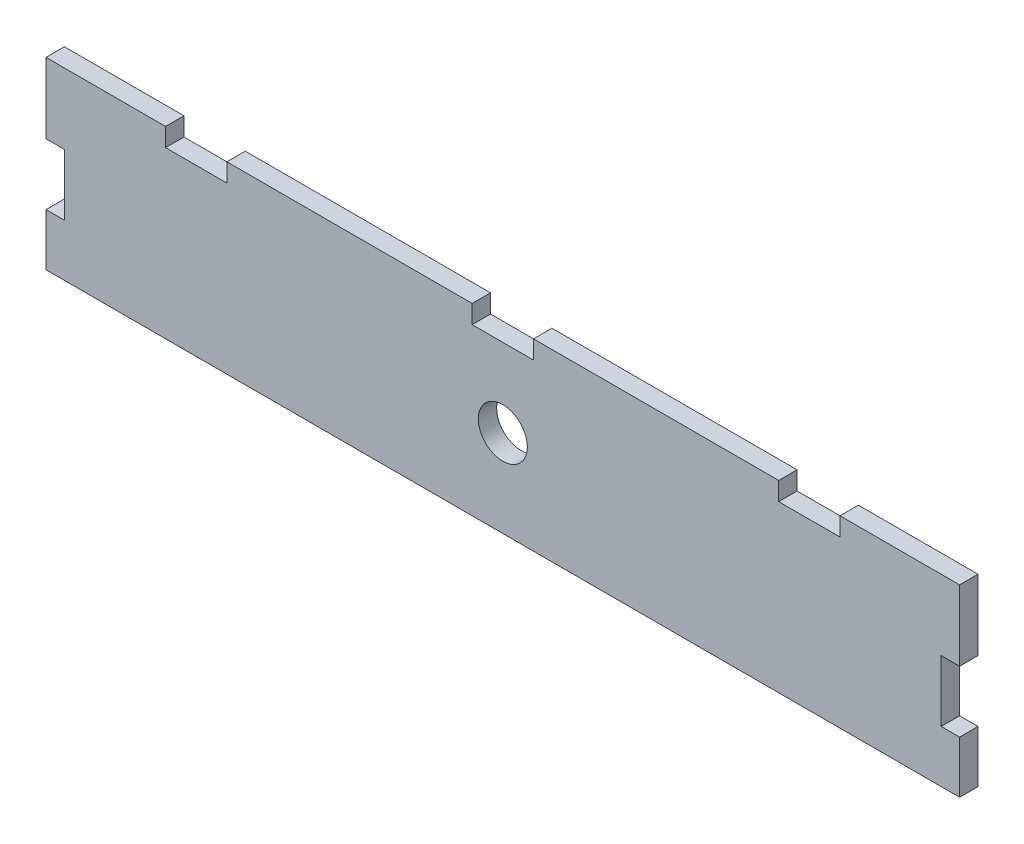
ISO-10303-21;
HEADER;
FILE_DESCRIPTION(('STEP AP214'),'2;1');
FILE_NAME('part.step','',(''),(''),'','','');
FILE_SCHEMA(('AUTOMOTIVE_DESIGN { 1 0 10303 214 1 1 1 1 }'));
ENDSEC;
DATA;
#1=APPLICATION_CONTEXT('core data for automotive mechanical design processes');
#2=APPLICATION_PROTOCOL_DEFINITION('international standard','automotive_design',2000,#1);
#3=PRODUCT_CONTEXT('',#1,'mechanical');
#4=PRODUCT('Part','Part','',(#3));
#5=PRODUCT_RELATED_PRODUCT_CATEGORY('part','',(#4));
#6=PRODUCT_DEFINITION_FORMATION('','',#4);
#7=PRODUCT_DEFINITION_CONTEXT('part definition',#1,'design');
#8=PRODUCT_DEFINITION('design','',#6,#7);
#9=PRODUCT_DEFINITION_SHAPE('','',#8);
#10=(LENGTH_UNIT() NAMED_UNIT(*) SI_UNIT(.MILLI.,.METRE.));
#11=(NAMED_UNIT(*) PLANE_ANGLE_UNIT() SI_UNIT($,.RADIAN.));
#12=(NAMED_UNIT(*) SI_UNIT($,.STERADIAN.) SOLID_ANGLE_UNIT());
#13=UNCERTAINTY_MEASURE_WITH_UNIT(LENGTH_MEASURE(1.E-05),#10,'distance_accuracy_value','');
#14=(GEOMETRIC_REPRESENTATION_CONTEXT(3) GLOBAL_UNCERTAINTY_ASSIGNED_CONTEXT((#13)) GLOBAL_UNIT_ASSIGNED_CONTEXT((#10,
#11,#12)) REPRESENTATION_CONTEXT('',''));
#15=CARTESIAN_POINT('',(0.,0.,0.));
#16=DIRECTION('',(0.,0.,1.));
#17=DIRECTION('',(1.,0.,0.));
#18=AXIS2_PLACEMENT_3D('',#15,#16,#17);
#19=CARTESIAN_POINT('',(74.5,-18.5,3.));
#20=DIRECTION('',(-1.,0.,0.));
#21=DIRECTION('',(0.,0.,1.));
#22=AXIS2_PLACEMENT_3D('',#19,#20,#21);
#23=PLANE('',#22);
#24=DIRECTION('',(0.,1.,0.));
#25=VECTOR('',#24,1.);
#26=CARTESIAN_POINT('',(74.5,-18.5,0.));
#27=LINE('',#26,#25);
#28=CARTESIAN_POINT('',(74.5,-27.,0.));
#29=VERTEX_POINT('',#28);
#30=CARTESIAN_POINT('',(74.5,-18.5,0.));
#31=VERTEX_POINT('',#30);
#32=EDGE_CURVE('E225',#29,#31,#27,.T.);
#33=ORIENTED_EDGE('',*,*,#32,.T.);
#34=DIRECTION('',(0.,0.,-1.));
#35=VECTOR('',#34,1.);
#36=CARTESIAN_POINT('',(74.5,-18.5,3.));
#37=LINE('',#36,#35);
#38=CARTESIAN_POINT('',(74.5,-18.5,3.));
#39=VERTEX_POINT('',#38);
#40=EDGE_CURVE('E11',#39,#31,#37,.T.);
#41=ORIENTED_EDGE('',*,*,#40,.F.);
#42=DIRECTION('',(0.,1.,0.));
#43=VECTOR('',#42,1.);
#44=CARTESIAN_POINT('',(74.5,-18.5,3.));
#45=LINE('',#44,#43);
#46=CARTESIAN_POINT('',(74.5,-27.,3.));
#47=VERTEX_POINT('',#46);
#48=EDGE_CURVE('E272',#47,#39,#45,.T.);
#49=ORIENTED_EDGE('',*,*,#48,.F.);
#50=DIRECTION('',(0.,0.,-1.));
#51=VECTOR('',#50,1.);
#52=CARTESIAN_POINT('',(74.5,-27.,3.));
#53=LINE('',#52,#51);
#54=EDGE_CURVE('E221',#47,#29,#53,.T.);
#55=ORIENTED_EDGE('',*,*,#54,.T.);
#56=EDGE_LOOP('',(#33,#41,#49,#55));
#57=FACE_BOUND('',#56,.T.);
#58=ADVANCED_FACE('F33',(#57),#23,.F.);
#59=CARTESIAN_POINT('',(71.5,-18.5,3.));
#60=DIRECTION('',(0.,-1.,0.));
#61=DIRECTION('',(0.,0.,-1.));
#62=AXIS2_PLACEMENT_3D('',#59,#60,#61);
#63=PLANE('',#62);
#64=DIRECTION('',(-1.,0.,0.));
#65=VECTOR('',#64,1.);
#66=CARTESIAN_POINT('',(71.5,-18.5,0.));
#67=LINE('',#66,#65);
#68=CARTESIAN_POINT('',(71.5,-18.5,0.));
#69=VERTEX_POINT('',#68);
#70=EDGE_CURVE('E228',#31,#69,#67,.T.);
#71=ORIENTED_EDGE('',*,*,#70,.T.);
#72=DIRECTION('',(0.,0.,-1.));
#73=VECTOR('',#72,1.);
#74=CARTESIAN_POINT('',(71.5,-18.5,3.));
#75=LINE('',#74,#73);
#76=CARTESIAN_POINT('',(71.5,-18.5,3.));
#77=VERTEX_POINT('',#76);
#78=EDGE_CURVE('E41',#77,#69,#75,.T.);
#79=ORIENTED_EDGE('',*,*,#78,.F.);
#80=DIRECTION('',(-1.,0.,0.));
#81=VECTOR('',#80,1.);
#82=CARTESIAN_POINT('',(71.5,-18.5,3.));
#83=LINE('',#82,#81);
#84=EDGE_CURVE('E140',#39,#77,#83,.T.);
#85=ORIENTED_EDGE('',*,*,#84,.F.);
#86=ORIENTED_EDGE('',*,*,#40,.T.);
#87=EDGE_LOOP('',(#71,#79,#85,#86));
#88=FACE_BOUND('',#87,.T.);
#89=ADVANCED_FACE('F411',(#88),#63,.F.);
#90=CARTESIAN_POINT('',(71.5,-8.5,3.));
#91=DIRECTION('',(-1.,0.,0.));
#92=DIRECTION('',(0.,0.,1.));
#93=AXIS2_PLACEMENT_3D('',#90,#91,#92);
#94=PLANE('',#93);
#95=DIRECTION('',(0.,1.,0.));
#96=VECTOR('',#95,1.);
#97=CARTESIAN_POINT('',(71.5,-8.5,0.));
#98=LINE('',#97,#96);
#99=CARTESIAN_POINT('',(71.5,-8.5,0.));
#100=VERTEX_POINT('',#99);
#101=EDGE_CURVE('E231',#69,#100,#98,.T.);
#102=ORIENTED_EDGE('',*,*,#101,.T.);
#103=DIRECTION('',(0.,0.,-1.));
#104=VECTOR('',#103,1.);
#105=CARTESIAN_POINT('',(71.5,-8.5,3.));
#106=LINE('',#105,#104);
#107=CARTESIAN_POINT('',(71.5,-8.5,3.));
#108=VERTEX_POINT('',#107);
#109=EDGE_CURVE('E327',#108,#100,#106,.T.);
#110=ORIENTED_EDGE('',*,*,#109,.F.);
#111=DIRECTION('',(0.,1.,0.));
#112=VECTOR('',#111,1.);
#113=CARTESIAN_POINT('',(71.5,-8.5,3.));
#114=LINE('',#113,#112);
#115=EDGE_CURVE('E335',#77,#108,#114,.T.);
#116=ORIENTED_EDGE('',*,*,#115,.F.);
#117=ORIENTED_EDGE('',*,*,#78,.T.);
#118=EDGE_LOOP('',(#102,#110,#116,#117));
#119=FACE_BOUND('',#118,.T.);
#120=ADVANCED_FACE('F333',(#119),#94,.F.);
#121=CARTESIAN_POINT('',(71.5,-8.5,3.));
#122=DIRECTION('',(0.,1.,0.));
#123=DIRECTION('',(0.,0.,1.));
#124=AXIS2_PLACEMENT_3D('',#121,#122,#123);
#125=PLANE('',#124);
#126=DIRECTION('',(1.,0.,0.));
#127=VECTOR('',#126,1.);
#128=CARTESIAN_POINT('',(71.5,-8.5,0.));
#129=LINE('',#128,#127);
#130=CARTESIAN_POINT('',(74.5,-8.5,0.));
#131=VERTEX_POINT('',#130);
#132=EDGE_CURVE('E233',#100,#131,#129,.T.);
#133=ORIENTED_EDGE('',*,*,#132,.T.);
#134=DIRECTION('',(0.,0.,-1.));
#135=VECTOR('',#134,1.);
#136=CARTESIAN_POINT('',(74.5,-8.5,3.));
#137=LINE('',#136,#135);
#138=CARTESIAN_POINT('',(74.5,-8.5,3.));
#139=VERTEX_POINT('',#138);
#140=EDGE_CURVE('E324',#139,#131,#137,.T.);
#141=ORIENTED_EDGE('',*,*,#140,.F.);
#142=DIRECTION('',(1.,0.,0.));
#143=VECTOR('',#142,1.);
#144=CARTESIAN_POINT('',(71.5,-8.5,3.));
#145=LINE('',#144,#143);
#146=EDGE_CURVE('E353',#108,#139,#145,.T.);
#147=ORIENTED_EDGE('',*,*,#146,.F.);
#148=ORIENTED_EDGE('',*,*,#109,.T.);
#149=EDGE_LOOP('',(#133,#141,#147,#148));
#150=FACE_BOUND('',#149,.T.);
#151=ADVANCED_FACE('F344',(#150),#125,.F.);
#152=CARTESIAN_POINT('',(74.5,3.00000000000001,3.));
#153=DIRECTION('',(-1.,0.,0.));
#154=DIRECTION('',(0.,-1.,0.));
#155=AXIS2_PLACEMENT_3D('',#152,#153,#154);
#156=PLANE('',#155);
#157=DIRECTION('',(0.,1.,0.));
#158=VECTOR('',#157,1.);
#159=CARTESIAN_POINT('',(74.5,3.00000000000001,0.));
#160=LINE('',#159,#158);
#161=CARTESIAN_POINT('',(74.5,3.00000000000001,0.));
#162=VERTEX_POINT('',#161);
#163=EDGE_CURVE('E235',#131,#162,#160,.T.);
#164=ORIENTED_EDGE('',*,*,#163,.T.);
#165=DIRECTION('',(0.,0.,-1.));
#166=VECTOR('',#165,1.);
#167=CARTESIAN_POINT('',(74.5,3.00000000000001,3.));
#168=LINE('',#167,#166);
#169=CARTESIAN_POINT('',(74.5,3.00000000000001,3.));
#170=VERTEX_POINT('',#169);
#171=EDGE_CURVE('E321',#170,#162,#168,.T.);
#172=ORIENTED_EDGE('',*,*,#171,.F.);
#173=DIRECTION('',(0.,1.,0.));
#174=VECTOR('',#173,1.);
#175=CARTESIAN_POINT('',(74.5,3.00000000000001,3.));
#176=LINE('',#175,#174);
#177=EDGE_CURVE('E350',#139,#170,#176,.T.);
#178=ORIENTED_EDGE('',*,*,#177,.F.);
#179=ORIENTED_EDGE('',*,*,#140,.T.);
#180=EDGE_LOOP('',(#164,#172,#178,#179));
#181=FACE_BOUND('',#180,.T.);
#182=ADVANCED_FACE('F348',(#181),#156,.F.);
#183=CARTESIAN_POINT('',(74.5,3.00000000000001,3.));
#184=DIRECTION('',(0.,-1.,0.));
#185=DIRECTION('',(1.,0.,0.));
#186=AXIS2_PLACEMENT_3D('',#183,#184,#185);
#187=PLANE('',#186);
#188=DIRECTION('',(-1.,0.,0.));
#189=VECTOR('',#188,1.);
#190=CARTESIAN_POINT('',(74.5,3.00000000000001,0.));
#191=LINE('',#190,#189);
#192=CARTESIAN_POINT('',(55.,2.99999999999999,0.));
#193=VERTEX_POINT('',#192);
#194=EDGE_CURVE('E237',#162,#193,#191,.T.);
#195=ORIENTED_EDGE('',*,*,#194,.T.);
#196=DIRECTION('',(0.,0.,-1.));
#197=VECTOR('',#196,1.);
#198=CARTESIAN_POINT('',(55.,2.99999999999999,3.));
#199=LINE('',#198,#197);
#200=CARTESIAN_POINT('',(55.,2.99999999999999,3.));
#201=VERTEX_POINT('',#200);
#202=EDGE_CURVE('E318',#201,#193,#199,.T.);
#203=ORIENTED_EDGE('',*,*,#202,.F.);
#204=DIRECTION('',(-1.,0.,0.));
#205=VECTOR('',#204,1.);
#206=CARTESIAN_POINT('',(74.5,3.00000000000001,3.));
#207=LINE('',#206,#205);
#208=EDGE_CURVE('E352',#170,#201,#207,.T.);
#209=ORIENTED_EDGE('',*,*,#208,.F.);
#210=ORIENTED_EDGE('',*,*,#171,.T.);
#211=EDGE_LOOP('',(#195,#203,#209,#210));
#212=FACE_BOUND('',#211,.T.);
#213=ADVANCED_FACE('F424',(#212),#187,.F.);
#214=CARTESIAN_POINT('',(55.,2.99999999999999,3.));
#215=DIRECTION('',(1.,0.,0.));
#216=DIRECTION('',(0.,0.,-1.));
#217=AXIS2_PLACEMENT_3D('',#214,#215,#216);
#218=PLANE('',#217);
#219=DIRECTION('',(0.,-1.,0.));
#220=VECTOR('',#219,1.);
#221=CARTESIAN_POINT('',(55.,2.99999999999999,0.));
#222=LINE('',#221,#220);
#223=CARTESIAN_POINT('',(55.,0.,0.));
#224=VERTEX_POINT('',#223);
#225=EDGE_CURVE('E239',#193,#224,#222,.T.);
#226=ORIENTED_EDGE('',*,*,#225,.T.);
#227=DIRECTION('',(0.,0.,-1.));
#228=VECTOR('',#227,1.);
#229=CARTESIAN_POINT('',(55.,0.,3.));
#230=LINE('',#229,#228);
#231=CARTESIAN_POINT('',(55.,0.,3.));
#232=VERTEX_POINT('',#231);
#233=EDGE_CURVE('E315',#232,#224,#230,.T.);
#234=ORIENTED_EDGE('',*,*,#233,.F.);
#235=DIRECTION('',(0.,-1.,0.));
#236=VECTOR('',#235,1.);
#237=CARTESIAN_POINT('',(55.,2.99999999999999,3.));
#238=LINE('',#237,#236);
#239=EDGE_CURVE('E355',#201,#232,#238,.T.);
#240=ORIENTED_EDGE('',*,*,#239,.F.);
#241=ORIENTED_EDGE('',*,*,#202,.T.);
#242=EDGE_LOOP('',(#226,#234,#240,#241));
#243=FACE_BOUND('',#242,.T.);
#244=ADVANCED_FACE('F427',(#243),#218,.F.);
#245=CARTESIAN_POINT('',(45.,0.,3.));
#246=DIRECTION('',(0.,-1.,0.));
#247=DIRECTION('',(0.,0.,-1.));
#248=AXIS2_PLACEMENT_3D('',#245,#246,#247);
#249=PLANE('',#248);
#250=DIRECTION('',(-1.,0.,0.));
#251=VECTOR('',#250,1.);
#252=CARTESIAN_POINT('',(45.,0.,0.));
#253=LINE('',#252,#251);
#254=CARTESIAN_POINT('',(45.,0.,0.));
#255=VERTEX_POINT('',#254);
#256=EDGE_CURVE('E241',#224,#255,#253,.T.);
#257=ORIENTED_EDGE('',*,*,#256,.T.);
#258=DIRECTION('',(0.,0.,-1.));
#259=VECTOR('',#258,1.);
#260=CARTESIAN_POINT('',(45.,0.,3.));
#261=LINE('',#260,#259);
#262=CARTESIAN_POINT('',(45.,0.,3.));
#263=VERTEX_POINT('',#262);
#264=EDGE_CURVE('E312',#263,#255,#261,.T.);
#265=ORIENTED_EDGE('',*,*,#264,.F.);
#266=DIRECTION('',(-1.,0.,0.));
#267=VECTOR('',#266,1.);
#268=CARTESIAN_POINT('',(45.,0.,3.));
#269=LINE('',#268,#267);
#270=EDGE_CURVE('E361',#232,#263,#269,.T.);
#271=ORIENTED_EDGE('',*,*,#270,.F.);
#272=ORIENTED_EDGE('',*,*,#233,.T.);
#273=EDGE_LOOP('',(#257,#265,#271,#272));
#274=FACE_BOUND('',#273,.T.);
#275=ADVANCED_FACE('F431',(#274),#249,.F.);
#276=CARTESIAN_POINT('',(45.,2.99999999999999,3.));
#277=DIRECTION('',(-1.,0.,0.));
#278=DIRECTION('',(0.,0.,1.));
#279=AXIS2_PLACEMENT_3D('',#276,#277,#278);
#280=PLANE('',#279);
#281=DIRECTION('',(0.,1.,0.));
#282=VECTOR('',#281,1.);
#283=CARTESIAN_POINT('',(45.,2.99999999999999,0.));
#284=LINE('',#283,#282);
#285=CARTESIAN_POINT('',(45.,2.99999999999999,0.));
#286=VERTEX_POINT('',#285);
#287=EDGE_CURVE('E243',#255,#286,#284,.T.);
#288=ORIENTED_EDGE('',*,*,#287,.T.);
#289=DIRECTION('',(0.,0.,-1.));
#290=VECTOR('',#289,1.);
#291=CARTESIAN_POINT('',(45.,2.99999999999999,3.));
#292=LINE('',#291,#290);
#293=CARTESIAN_POINT('',(45.,2.99999999999999,3.));
#294=VERTEX_POINT('',#293);
#295=EDGE_CURVE('E309',#294,#286,#292,.T.);
#296=ORIENTED_EDGE('',*,*,#295,.F.);
#297=DIRECTION('',(0.,1.,0.));
#298=VECTOR('',#297,1.);
#299=CARTESIAN_POINT('',(45.,2.99999999999999,3.));
#300=LINE('',#299,#298);
#301=EDGE_CURVE('E363',#263,#294,#300,.T.);
#302=ORIENTED_EDGE('',*,*,#301,.F.);
#303=ORIENTED_EDGE('',*,*,#264,.T.);
#304=EDGE_LOOP('',(#288,#296,#302,#303));
#305=FACE_BOUND('',#304,.T.);
#306=ADVANCED_FACE('F435',(#305),#280,.F.);
#307=CARTESIAN_POINT('',(45.,2.99999999999999,3.));
#308=DIRECTION('',(0.,-1.,0.));
#309=DIRECTION('',(1.,0.,0.));
#310=AXIS2_PLACEMENT_3D('',#307,#308,#309);
#311=PLANE('',#310);
#312=DIRECTION('',(-1.,0.,0.));
#313=VECTOR('',#312,1.);
#314=CARTESIAN_POINT('',(45.,2.99999999999999,0.));
#315=LINE('',#314,#313);
#316=CARTESIAN_POINT('',(5.,3.,0.));
#317=VERTEX_POINT('',#316);
#318=EDGE_CURVE('E245',#286,#317,#315,.T.);
#319=ORIENTED_EDGE('',*,*,#318,.T.);
#320=DIRECTION('',(0.,0.,-1.));
#321=VECTOR('',#320,1.);
#322=CARTESIAN_POINT('',(5.,3.,3.));
#323=LINE('',#322,#321);
#324=CARTESIAN_POINT('',(5.,3.,3.));
#325=VERTEX_POINT('',#324);
#326=EDGE_CURVE('E306',#325,#317,#323,.T.);
#327=ORIENTED_EDGE('',*,*,#326,.F.);
#328=DIRECTION('',(-1.,0.,0.));
#329=VECTOR('',#328,1.);
#330=CARTESIAN_POINT('',(45.,2.99999999999999,3.));
#331=LINE('',#330,#329);
#332=EDGE_CURVE('E365',#294,#325,#331,.T.);
#333=ORIENTED_EDGE('',*,*,#332,.F.);
#334=ORIENTED_EDGE('',*,*,#295,.T.);
#335=EDGE_LOOP('',(#319,#327,#333,#334));
#336=FACE_BOUND('',#335,.T.);
#337=ADVANCED_FACE('F439',(#336),#311,.F.);
#338=CARTESIAN_POINT('',(5.,3.,3.));
#339=DIRECTION('',(1.,0.,0.));
#340=DIRECTION('',(0.,1.,0.));
#341=AXIS2_PLACEMENT_3D('',#338,#339,#340);
#342=PLANE('',#341);
#343=DIRECTION('',(0.,-1.,0.));
#344=VECTOR('',#343,1.);
#345=CARTESIAN_POINT('',(5.,3.,0.));
#346=LINE('',#345,#344);
#347=CARTESIAN_POINT('',(5.,0.,0.));
#348=VERTEX_POINT('',#347);
#349=EDGE_CURVE('E247',#317,#348,#346,.T.);
#350=ORIENTED_EDGE('',*,*,#349,.T.);
#351=DIRECTION('',(0.,0.,-1.));
#352=VECTOR('',#351,1.);
#353=CARTESIAN_POINT('',(5.,0.,3.));
#354=LINE('',#353,#352);
#355=CARTESIAN_POINT('',(5.,0.,3.));
#356=VERTEX_POINT('',#355);
#357=EDGE_CURVE('E303',#356,#348,#354,.T.);
#358=ORIENTED_EDGE('',*,*,#357,.F.);
#359=DIRECTION('',(0.,-1.,0.));
#360=VECTOR('',#359,1.);
#361=CARTESIAN_POINT('',(5.,3.,3.));
#362=LINE('',#361,#360);
#363=EDGE_CURVE('E367',#325,#356,#362,.T.);
#364=ORIENTED_EDGE('',*,*,#363,.F.);
#365=ORIENTED_EDGE('',*,*,#326,.T.);
#366=EDGE_LOOP('',(#350,#358,#364,#365));
#367=FACE_BOUND('',#366,.T.);
#368=ADVANCED_FACE('F443',(#367),#342,.F.);
#369=CARTESIAN_POINT('',(-5.,0.,3.));
#370=DIRECTION('',(0.,-1.,0.));
#371=DIRECTION('',(0.,0.,-1.));
#372=AXIS2_PLACEMENT_3D('',#369,#370,#371);
#373=PLANE('',#372);
#374=DIRECTION('',(-1.,0.,0.));
#375=VECTOR('',#374,1.);
#376=CARTESIAN_POINT('',(-5.,0.,0.));
#377=LINE('',#376,#375);
#378=CARTESIAN_POINT('',(-5.,0.,0.));
#379=VERTEX_POINT('',#378);
#380=EDGE_CURVE('E249',#348,#379,#377,.T.);
#381=ORIENTED_EDGE('',*,*,#380,.T.);
#382=DIRECTION('',(0.,0.,-1.));
#383=VECTOR('',#382,1.);
#384=CARTESIAN_POINT('',(-5.,0.,3.));
#385=LINE('',#384,#383);
#386=CARTESIAN_POINT('',(-5.,0.,3.));
#387=VERTEX_POINT('',#386);
#388=EDGE_CURVE('E300',#387,#379,#385,.T.);
#389=ORIENTED_EDGE('',*,*,#388,.F.);
#390=DIRECTION('',(-1.,0.,0.));
#391=VECTOR('',#390,1.);
#392=CARTESIAN_POINT('',(-5.,0.,3.));
#393=LINE('',#392,#391);
#394=EDGE_CURVE('E369',#356,#387,#393,.T.);
#395=ORIENTED_EDGE('',*,*,#394,.F.);
#396=ORIENTED_EDGE('',*,*,#357,.T.);
#397=EDGE_LOOP('',(#381,#389,#395,#396));
#398=FACE_BOUND('',#397,.T.);
#399=ADVANCED_FACE('F447',(#398),#373,.F.);
#400=CARTESIAN_POINT('',(-5.,3.,3.));
#401=DIRECTION('',(-1.,0.,0.));
#402=DIRECTION('',(0.,-1.,0.));
#403=AXIS2_PLACEMENT_3D('',#400,#401,#402);
#404=PLANE('',#403);
#405=DIRECTION('',(0.,1.,0.));
#406=VECTOR('',#405,1.);
#407=CARTESIAN_POINT('',(-5.,3.,0.));
#408=LINE('',#407,#406);
#409=CARTESIAN_POINT('',(-5.,3.,0.));
#410=VERTEX_POINT('',#409);
#411=EDGE_CURVE('E251',#379,#410,#408,.T.);
#412=ORIENTED_EDGE('',*,*,#411,.T.);
#413=DIRECTION('',(0.,0.,-1.));
#414=VECTOR('',#413,1.);
#415=CARTESIAN_POINT('',(-5.,3.,3.));
#416=LINE('',#415,#414);
#417=CARTESIAN_POINT('',(-5.,3.,3.));
#418=VERTEX_POINT('',#417);
#419=EDGE_CURVE('E297',#418,#410,#416,.T.);
#420=ORIENTED_EDGE('',*,*,#419,.F.);
#421=DIRECTION('',(0.,1.,0.));
#422=VECTOR('',#421,1.);
#423=CARTESIAN_POINT('',(-5.,3.,3.));
#424=LINE('',#423,#422);
#425=EDGE_CURVE('E371',#387,#418,#424,.T.);
#426=ORIENTED_EDGE('',*,*,#425,.F.);
#427=ORIENTED_EDGE('',*,*,#388,.T.);
#428=EDGE_LOOP('',(#412,#420,#426,#427));
#429=FACE_BOUND('',#428,.T.);
#430=ADVANCED_FACE('F451',(#429),#404,.F.);
#431=CARTESIAN_POINT('',(-5.,3.,3.));
#432=DIRECTION('',(0.,-1.,0.));
#433=DIRECTION('',(1.,0.,0.));
#434=AXIS2_PLACEMENT_3D('',#431,#432,#433);
#435=PLANE('',#434);
#436=DIRECTION('',(-1.,0.,0.));
#437=VECTOR('',#436,1.);
#438=CARTESIAN_POINT('',(-5.,3.,0.));
#439=LINE('',#438,#437);
#440=CARTESIAN_POINT('',(-45.,2.99999999999999,0.));
#441=VERTEX_POINT('',#440);
#442=EDGE_CURVE('E253',#410,#441,#439,.T.);
#443=ORIENTED_EDGE('',*,*,#442,.T.);
#444=DIRECTION('',(0.,0.,-1.));
#445=VECTOR('',#444,1.);
#446=CARTESIAN_POINT('',(-45.,2.99999999999999,3.));
#447=LINE('',#446,#445);
#448=CARTESIAN_POINT('',(-45.,2.99999999999999,3.));
#449=VERTEX_POINT('',#448);
#450=EDGE_CURVE('E294',#449,#441,#447,.T.);
#451=ORIENTED_EDGE('',*,*,#450,.F.);
#452=DIRECTION('',(-1.,0.,0.));
#453=VECTOR('',#452,1.);
#454=CARTESIAN_POINT('',(-5.,3.,3.));
#455=LINE('',#454,#453);
#456=EDGE_CURVE('E373',#418,#449,#455,.T.);
#457=ORIENTED_EDGE('',*,*,#456,.F.);
#458=ORIENTED_EDGE('',*,*,#419,.T.);
#459=EDGE_LOOP('',(#443,#451,#457,#458));
#460=FACE_BOUND('',#459,.T.);
#461=ADVANCED_FACE('F455',(#460),#435,.F.);
#462=CARTESIAN_POINT('',(-45.,2.99999999999999,3.));
#463=DIRECTION('',(1.,0.,0.));
#464=DIRECTION('',(0.,0.,-1.));
#465=AXIS2_PLACEMENT_3D('',#462,#463,#464);
#466=PLANE('',#465);
#467=DIRECTION('',(0.,-1.,0.));
#468=VECTOR('',#467,1.);
#469=CARTESIAN_POINT('',(-45.,2.99999999999999,0.));
#470=LINE('',#469,#468);
#471=CARTESIAN_POINT('',(-45.,0.,0.));
#472=VERTEX_POINT('',#471);
#473=EDGE_CURVE('E255',#441,#472,#470,.T.);
#474=ORIENTED_EDGE('',*,*,#473,.T.);
#475=DIRECTION('',(0.,0.,-1.));
#476=VECTOR('',#475,1.);
#477=CARTESIAN_POINT('',(-45.,0.,3.));
#478=LINE('',#477,#476);
#479=CARTESIAN_POINT('',(-45.,0.,3.));
#480=VERTEX_POINT('',#479);
#481=EDGE_CURVE('E291',#480,#472,#478,.T.);
#482=ORIENTED_EDGE('',*,*,#481,.F.);
#483=DIRECTION('',(0.,-1.,0.));
#484=VECTOR('',#483,1.);
#485=CARTESIAN_POINT('',(-45.,2.99999999999999,3.));
#486=LINE('',#485,#484);
#487=EDGE_CURVE('E375',#449,#480,#486,.T.);
#488=ORIENTED_EDGE('',*,*,#487,.F.);
#489=ORIENTED_EDGE('',*,*,#450,.T.);
#490=EDGE_LOOP('',(#474,#482,#488,#489));
#491=FACE_BOUND('',#490,.T.);
#492=ADVANCED_FACE('F459',(#491),#466,.F.);
#493=CARTESIAN_POINT('',(-45.,0.,3.));
#494=DIRECTION('',(0.,-1.,0.));
#495=DIRECTION('',(0.,0.,-1.));
#496=AXIS2_PLACEMENT_3D('',#493,#494,#495);
#497=PLANE('',#496);
#498=DIRECTION('',(-1.,0.,0.));
#499=VECTOR('',#498,1.);
#500=CARTESIAN_POINT('',(-45.,0.,0.));
#501=LINE('',#500,#499);
#502=CARTESIAN_POINT('',(-55.,0.,0.));
#503=VERTEX_POINT('',#502);
#504=EDGE_CURVE('E257',#472,#503,#501,.T.);
#505=ORIENTED_EDGE('',*,*,#504,.T.);
#506=DIRECTION('',(0.,0.,-1.));
#507=VECTOR('',#506,1.);
#508=CARTESIAN_POINT('',(-55.,0.,3.));
#509=LINE('',#508,#507);
#510=CARTESIAN_POINT('',(-55.,0.,3.));
#511=VERTEX_POINT('',#510);
#512=EDGE_CURVE('E288',#511,#503,#509,.T.);
#513=ORIENTED_EDGE('',*,*,#512,.F.);
#514=DIRECTION('',(-1.,0.,0.));
#515=VECTOR('',#514,1.);
#516=CARTESIAN_POINT('',(-45.,0.,3.));
#517=LINE('',#516,#515);
#518=EDGE_CURVE('E377',#480,#511,#517,.T.);
#519=ORIENTED_EDGE('',*,*,#518,.F.);
#520=ORIENTED_EDGE('',*,*,#481,.T.);
#521=EDGE_LOOP('',(#505,#513,#519,#520));
#522=FACE_BOUND('',#521,.T.);
#523=ADVANCED_FACE('F463',(#522),#497,.F.);
#524=CARTESIAN_POINT('',(-55.,2.99999999999999,3.));
#525=DIRECTION('',(-1.,0.,0.));
#526=DIRECTION('',(0.,0.,1.));
#527=AXIS2_PLACEMENT_3D('',#524,#525,#526);
#528=PLANE('',#527);
#529=DIRECTION('',(0.,1.,0.));
#530=VECTOR('',#529,1.);
#531=CARTESIAN_POINT('',(-55.,2.99999999999999,0.));
#532=LINE('',#531,#530);
#533=CARTESIAN_POINT('',(-55.,2.99999999999999,0.));
#534=VERTEX_POINT('',#533);
#535=EDGE_CURVE('E259',#503,#534,#532,.T.);
#536=ORIENTED_EDGE('',*,*,#535,.T.);
#537=DIRECTION('',(0.,0.,-1.));
#538=VECTOR('',#537,1.);
#539=CARTESIAN_POINT('',(-55.,2.99999999999999,3.));
#540=LINE('',#539,#538);
#541=CARTESIAN_POINT('',(-55.,2.99999999999999,3.));
#542=VERTEX_POINT('',#541);
#543=EDGE_CURVE('E285',#542,#534,#540,.T.);
#544=ORIENTED_EDGE('',*,*,#543,.F.);
#545=DIRECTION('',(0.,1.,0.));
#546=VECTOR('',#545,1.);
#547=CARTESIAN_POINT('',(-55.,2.99999999999999,3.));
#548=LINE('',#547,#546);
#549=EDGE_CURVE('E379',#511,#542,#548,.T.);
#550=ORIENTED_EDGE('',*,*,#549,.F.);
#551=ORIENTED_EDGE('',*,*,#512,.T.);
#552=EDGE_LOOP('',(#536,#544,#550,#551));
#553=FACE_BOUND('',#552,.T.);
#554=ADVANCED_FACE('F467',(#553),#528,.F.);
#555=CARTESIAN_POINT('',(-55.,2.99999999999999,3.));
#556=DIRECTION('',(0.,-1.,0.));
#557=DIRECTION('',(1.,0.,0.));
#558=AXIS2_PLACEMENT_3D('',#555,#556,#557);
#559=PLANE('',#558);
#560=DIRECTION('',(-1.,0.,0.));
#561=VECTOR('',#560,1.);
#562=CARTESIAN_POINT('',(-55.,2.99999999999999,0.));
#563=LINE('',#562,#561);
#564=CARTESIAN_POINT('',(-74.5,2.99999999999999,0.));
#565=VERTEX_POINT('',#564);
#566=EDGE_CURVE('E261',#534,#565,#563,.T.);
#567=ORIENTED_EDGE('',*,*,#566,.T.);
#568=DIRECTION('',(0.,0.,-1.));
#569=VECTOR('',#568,1.);
#570=CARTESIAN_POINT('',(-74.5,2.99999999999999,3.));
#571=LINE('',#570,#569);
#572=CARTESIAN_POINT('',(-74.5,2.99999999999999,3.));
#573=VERTEX_POINT('',#572);
#574=EDGE_CURVE('E282',#573,#565,#571,.T.);
#575=ORIENTED_EDGE('',*,*,#574,.F.);
#576=DIRECTION('',(-1.,0.,0.));
#577=VECTOR('',#576,1.);
#578=CARTESIAN_POINT('',(-55.,2.99999999999999,3.));
#579=LINE('',#578,#577);
#580=EDGE_CURVE('E381',#542,#573,#579,.T.);
#581=ORIENTED_EDGE('',*,*,#580,.F.);
#582=ORIENTED_EDGE('',*,*,#543,.T.);
#583=EDGE_LOOP('',(#567,#575,#581,#582));
#584=FACE_BOUND('',#583,.T.);
#585=ADVANCED_FACE('F471',(#584),#559,.F.);
#586=CARTESIAN_POINT('',(-74.5,2.99999999999999,3.));
#587=DIRECTION('',(1.,0.,0.));
#588=DIRECTION('',(0.,0.,-1.));
#589=AXIS2_PLACEMENT_3D('',#586,#587,#588);
#590=PLANE('',#589);
#591=DIRECTION('',(0.,-1.,0.));
#592=VECTOR('',#591,1.);
#593=CARTESIAN_POINT('',(-74.5,2.99999999999999,0.));
#594=LINE('',#593,#592);
#595=CARTESIAN_POINT('',(-74.5,-8.5,0.));
#596=VERTEX_POINT('',#595);
#597=EDGE_CURVE('E263',#565,#596,#594,.T.);
#598=ORIENTED_EDGE('',*,*,#597,.T.);
#599=DIRECTION('',(0.,0.,-1.));
#600=VECTOR('',#599,1.);
#601=CARTESIAN_POINT('',(-74.5,-8.5,3.));
#602=LINE('',#601,#600);
#603=CARTESIAN_POINT('',(-74.5,-8.5,3.));
#604=VERTEX_POINT('',#603);
#605=EDGE_CURVE('E279',#604,#596,#602,.T.);
#606=ORIENTED_EDGE('',*,*,#605,.F.);
#607=DIRECTION('',(0.,-1.,0.));
#608=VECTOR('',#607,1.);
#609=CARTESIAN_POINT('',(-74.5,2.99999999999999,3.));
#610=LINE('',#609,#608);
#611=EDGE_CURVE('E383',#573,#604,#610,.T.);
#612=ORIENTED_EDGE('',*,*,#611,.F.);
#613=ORIENTED_EDGE('',*,*,#574,.T.);
#614=EDGE_LOOP('',(#598,#606,#612,#613));
#615=FACE_BOUND('',#614,.T.);
#616=ADVANCED_FACE('F475',(#615),#590,.F.);
#617=CARTESIAN_POINT('',(-71.5,-8.5,3.));
#618=DIRECTION('',(0.,1.,0.));
#619=DIRECTION('',(0.,0.,1.));
#620=AXIS2_PLACEMENT_3D('',#617,#618,#619);
#621=PLANE('',#620);
#622=DIRECTION('',(1.,0.,0.));
#623=VECTOR('',#622,1.);
#624=CARTESIAN_POINT('',(-71.5,-8.5,0.));
#625=LINE('',#624,#623);
#626=CARTESIAN_POINT('',(-71.5,-8.5,0.));
#627=VERTEX_POINT('',#626);
#628=EDGE_CURVE('E265',#596,#627,#625,.T.);
#629=ORIENTED_EDGE('',*,*,#628,.T.);
#630=DIRECTION('',(0.,0.,-1.));
#631=VECTOR('',#630,1.);
#632=CARTESIAN_POINT('',(-71.5,-8.5,3.));
#633=LINE('',#632,#631);
#634=CARTESIAN_POINT('',(-71.5,-8.5,3.));
#635=VERTEX_POINT('',#634);
#636=EDGE_CURVE('E276',#635,#627,#633,.T.);
#637=ORIENTED_EDGE('',*,*,#636,.F.);
#638=DIRECTION('',(1.,0.,0.));
#639=VECTOR('',#638,1.);
#640=CARTESIAN_POINT('',(-71.5,-8.5,3.));
#641=LINE('',#640,#639);
#642=EDGE_CURVE('E385',#604,#635,#641,.T.);
#643=ORIENTED_EDGE('',*,*,#642,.F.);
#644=ORIENTED_EDGE('',*,*,#605,.T.);
#645=EDGE_LOOP('',(#629,#637,#643,#644));
#646=FACE_BOUND('',#645,.T.);
#647=ADVANCED_FACE('F391',(#646),#621,.F.);
#648=CARTESIAN_POINT('',(-71.5,-8.5,3.));
#649=DIRECTION('',(1.,0.,0.));
#650=DIRECTION('',(0.,0.,-1.));
#651=AXIS2_PLACEMENT_3D('',#648,#649,#650);
#652=PLANE('',#651);
#653=DIRECTION('',(0.,-1.,0.));
#654=VECTOR('',#653,1.);
#655=CARTESIAN_POINT('',(-71.5,-8.5,0.));
#656=LINE('',#655,#654);
#657=CARTESIAN_POINT('',(-71.5,-18.5,0.));
#658=VERTEX_POINT('',#657);
#659=EDGE_CURVE('E267',#627,#658,#656,.T.);
#660=ORIENTED_EDGE('',*,*,#659,.T.);
#661=DIRECTION('',(0.,0.,-1.));
#662=VECTOR('',#661,1.);
#663=CARTESIAN_POINT('',(-71.5,-18.5,3.));
#664=LINE('',#663,#662);
#665=CARTESIAN_POINT('',(-71.5,-18.5,3.));
#666=VERTEX_POINT('',#665);
#667=EDGE_CURVE('E216',#666,#658,#664,.T.);
#668=ORIENTED_EDGE('',*,*,#667,.F.);
#669=DIRECTION('',(0.,-1.,0.));
#670=VECTOR('',#669,1.);
#671=CARTESIAN_POINT('',(-71.5,-8.5,3.));
#672=LINE('',#671,#670);
#673=EDGE_CURVE('E207',#635,#666,#672,.T.);
#674=ORIENTED_EDGE('',*,*,#673,.F.);
#675=ORIENTED_EDGE('',*,*,#636,.T.);
#676=EDGE_LOOP('',(#660,#668,#674,#675));
#677=FACE_BOUND('',#676,.T.);
#678=ADVANCED_FACE('F395',(#677),#652,.F.);
#679=CARTESIAN_POINT('',(-71.5,-18.5,3.));
#680=DIRECTION('',(0.,-1.,0.));
#681=DIRECTION('',(0.,0.,-1.));
#682=AXIS2_PLACEMENT_3D('',#679,#680,#681);
#683=PLANE('',#682);
#684=DIRECTION('',(-1.,0.,0.));
#685=VECTOR('',#684,1.);
#686=CARTESIAN_POINT('',(-71.5,-18.5,0.));
#687=LINE('',#686,#685);
#688=CARTESIAN_POINT('',(-74.5,-18.5,0.));
#689=VERTEX_POINT('',#688);
#690=EDGE_CURVE('E215',#658,#689,#687,.T.);
#691=ORIENTED_EDGE('',*,*,#690,.T.);
#692=DIRECTION('',(0.,0.,-1.));
#693=VECTOR('',#692,1.);
#694=CARTESIAN_POINT('',(-74.5,-18.5,3.));
#695=LINE('',#694,#693);
#696=CARTESIAN_POINT('',(-74.5,-18.5,3.));
#697=VERTEX_POINT('',#696);
#698=EDGE_CURVE('E212',#697,#689,#695,.T.);
#699=ORIENTED_EDGE('',*,*,#698,.F.);
#700=DIRECTION('',(-1.,0.,0.));
#701=VECTOR('',#700,1.);
#702=CARTESIAN_POINT('',(-71.5,-18.5,3.));
#703=LINE('',#702,#701);
#704=EDGE_CURVE('E201',#666,#697,#703,.T.);
#705=ORIENTED_EDGE('',*,*,#704,.F.);
#706=ORIENTED_EDGE('',*,*,#667,.T.);
#707=EDGE_LOOP('',(#691,#699,#705,#706));
#708=FACE_BOUND('',#707,.T.);
#709=ADVANCED_FACE('F213',(#708),#683,.F.);
#710=CARTESIAN_POINT('',(-74.5,-18.5,3.));
#711=DIRECTION('',(1.,0.,0.));
#712=DIRECTION('',(0.,0.,-1.));
#713=AXIS2_PLACEMENT_3D('',#710,#711,#712);
#714=PLANE('',#713);
#715=DIRECTION('',(0.,-1.,0.));
#716=VECTOR('',#715,1.);
#717=CARTESIAN_POINT('',(-74.5,-18.5,0.));
#718=LINE('',#717,#716);
#719=CARTESIAN_POINT('',(-74.5,-27.,0.));
#720=VERTEX_POINT('',#719);
#721=EDGE_CURVE('E126',#689,#720,#718,.T.);
#722=ORIENTED_EDGE('',*,*,#721,.T.);
#723=DIRECTION('',(0.,0.,-1.));
#724=VECTOR('',#723,1.);
#725=CARTESIAN_POINT('',(-74.5,-27.,3.));
#726=LINE('',#725,#724);
#727=CARTESIAN_POINT('',(-74.5,-27.,3.));
#728=VERTEX_POINT('',#727);
#729=EDGE_CURVE('E217',#728,#720,#726,.T.);
#730=ORIENTED_EDGE('',*,*,#729,.F.);
#731=DIRECTION('',(0.,-1.,0.));
#732=VECTOR('',#731,1.);
#733=CARTESIAN_POINT('',(-74.5,-18.5,3.));
#734=LINE('',#733,#732);
#735=EDGE_CURVE('E205',#697,#728,#734,.T.);
#736=ORIENTED_EDGE('',*,*,#735,.F.);
#737=ORIENTED_EDGE('',*,*,#698,.T.);
#738=EDGE_LOOP('',(#722,#730,#736,#737));
#739=FACE_BOUND('',#738,.T.);
#740=ADVANCED_FACE('F219',(#739),#714,.F.);
#741=CARTESIAN_POINT('',(-74.5,-27.,3.));
#742=DIRECTION('',(0.,1.,0.));
#743=DIRECTION('',(0.,0.,1.));
#744=AXIS2_PLACEMENT_3D('',#741,#742,#743);
#745=PLANE('',#744);
#746=DIRECTION('',(1.,0.,0.));
#747=VECTOR('',#746,1.);
#748=CARTESIAN_POINT('',(-74.5,-27.,0.));
#749=LINE('',#748,#747);
#750=EDGE_CURVE('E132',#720,#29,#749,.T.);
#751=ORIENTED_EDGE('',*,*,#750,.T.);
#752=ORIENTED_EDGE('',*,*,#54,.F.);
#753=DIRECTION('',(1.,0.,0.));
#754=VECTOR('',#753,1.);
#755=CARTESIAN_POINT('',(-74.5,-27.,3.));
#756=LINE('',#755,#754);
#757=EDGE_CURVE('E49',#728,#47,#756,.T.);
#758=ORIENTED_EDGE('',*,*,#757,.F.);
#759=ORIENTED_EDGE('',*,*,#729,.T.);
#760=EDGE_LOOP('',(#751,#752,#758,#759));
#761=FACE_BOUND('',#760,.T.);
#762=ADVANCED_FACE('F399',(#761),#745,.F.);
#763=CARTESIAN_POINT('',(0.,0.,3.));
#764=DIRECTION('',(0.,0.,1.));
#765=DIRECTION('',(1.,0.,0.));
#766=AXIS2_PLACEMENT_3D('',#763,#764,#765);
#767=PLANE('',#766);
#768=CARTESIAN_POINT('',(0.,-12.79,3.));
#769=DIRECTION('',(0.,0.,1.));
#770=DIRECTION('',(1.,0.,0.));
#771=AXIS2_PLACEMENT_3D('',#768,#769,#770);
#772=CIRCLE('',#771,4.);
#773=CARTESIAN_POINT('',(4.,-12.79,3.));
#774=VERTEX_POINT('',#773);
#775=EDGE_CURVE('E229',#774,#774,#772,.T.);
#776=ORIENTED_EDGE('',*,*,#775,.F.);
#777=EDGE_LOOP('',(#776));
#778=FACE_BOUND('',#777,.T.);
#779=ORIENTED_EDGE('',*,*,#48,.T.);
#780=ORIENTED_EDGE('',*,*,#84,.T.);
#781=ORIENTED_EDGE('',*,*,#115,.T.);
#782=ORIENTED_EDGE('',*,*,#146,.T.);
#783=ORIENTED_EDGE('',*,*,#177,.T.);
#784=ORIENTED_EDGE('',*,*,#208,.T.);
#785=ORIENTED_EDGE('',*,*,#239,.T.);
#786=ORIENTED_EDGE('',*,*,#270,.T.);
#787=ORIENTED_EDGE('',*,*,#301,.T.);
#788=ORIENTED_EDGE('',*,*,#332,.T.);
#789=ORIENTED_EDGE('',*,*,#363,.T.);
#790=ORIENTED_EDGE('',*,*,#394,.T.);
#791=ORIENTED_EDGE('',*,*,#425,.T.);
#792=ORIENTED_EDGE('',*,*,#456,.T.);
#793=ORIENTED_EDGE('',*,*,#487,.T.);
#794=ORIENTED_EDGE('',*,*,#518,.T.);
#795=ORIENTED_EDGE('',*,*,#549,.T.);
#796=ORIENTED_EDGE('',*,*,#580,.T.);
#797=ORIENTED_EDGE('',*,*,#611,.T.);
#798=ORIENTED_EDGE('',*,*,#642,.T.);
#799=ORIENTED_EDGE('',*,*,#673,.T.);
#800=ORIENTED_EDGE('',*,*,#704,.T.);
#801=ORIENTED_EDGE('',*,*,#735,.T.);
#802=ORIENTED_EDGE('',*,*,#757,.T.);
#803=EDGE_LOOP('',(#779,#780,#781,#782,#783,#784,#785,#786,#787,#788,#789,#790,#791,#792,#793,
#794,#795,#796,#797,#798,#799,#800,#801,#802));
#804=FACE_BOUND('',#803,.T.);
#805=ADVANCED_FACE('F203',(#778,#804),#767,.T.);
#806=CARTESIAN_POINT('',(0.,0.,0.));
#807=DIRECTION('',(0.,0.,1.));
#808=DIRECTION('',(1.,0.,0.));
#809=AXIS2_PLACEMENT_3D('',#806,#807,#808);
#810=PLANE('',#809);
#811=CARTESIAN_POINT('',(0.,-12.79,0.));
#812=DIRECTION('',(0.,0.,1.));
#813=DIRECTION('',(1.,0.,0.));
#814=AXIS2_PLACEMENT_3D('',#811,#812,#813);
#815=CIRCLE('',#814,4.);
#816=CARTESIAN_POINT('',(4.,-12.79,0.));
#817=VERTEX_POINT('',#816);
#818=EDGE_CURVE('E534',#817,#817,#815,.T.);
#819=ORIENTED_EDGE('',*,*,#818,.T.);
#820=EDGE_LOOP('',(#819));
#821=FACE_BOUND('',#820,.T.);
#822=ORIENTED_EDGE('',*,*,#32,.F.);
#823=ORIENTED_EDGE('',*,*,#750,.F.);
#824=ORIENTED_EDGE('',*,*,#721,.F.);
#825=ORIENTED_EDGE('',*,*,#690,.F.);
#826=ORIENTED_EDGE('',*,*,#659,.F.);
#827=ORIENTED_EDGE('',*,*,#628,.F.);
#828=ORIENTED_EDGE('',*,*,#597,.F.);
#829=ORIENTED_EDGE('',*,*,#566,.F.);
#830=ORIENTED_EDGE('',*,*,#535,.F.);
#831=ORIENTED_EDGE('',*,*,#504,.F.);
#832=ORIENTED_EDGE('',*,*,#473,.F.);
#833=ORIENTED_EDGE('',*,*,#442,.F.);
#834=ORIENTED_EDGE('',*,*,#411,.F.);
#835=ORIENTED_EDGE('',*,*,#380,.F.);
#836=ORIENTED_EDGE('',*,*,#349,.F.);
#837=ORIENTED_EDGE('',*,*,#318,.F.);
#838=ORIENTED_EDGE('',*,*,#287,.F.);
#839=ORIENTED_EDGE('',*,*,#256,.F.);
#840=ORIENTED_EDGE('',*,*,#225,.F.);
#841=ORIENTED_EDGE('',*,*,#194,.F.);
#842=ORIENTED_EDGE('',*,*,#163,.F.);
#843=ORIENTED_EDGE('',*,*,#132,.F.);
#844=ORIENTED_EDGE('',*,*,#101,.F.);
#845=ORIENTED_EDGE('',*,*,#70,.F.);
#846=EDGE_LOOP('',(#822,#823,#824,#825,#826,#827,#828,#829,#830,#831,#832,#833,#834,#835,#836,
#837,#838,#839,#840,#841,#842,#843,#844,#845));
#847=FACE_BOUND('',#846,.T.);
#848=ADVANCED_FACE('F339',(#821,#847),#810,.F.);
#849=CARTESIAN_POINT('',(0.,-12.79,3.));
#850=DIRECTION('',(0.,0.,-1.));
#851=DIRECTION('',(-1.,0.,0.));
#852=AXIS2_PLACEMENT_3D('',#849,#850,#851);
#853=CYLINDRICAL_SURFACE('',#852,4.);
#854=ORIENTED_EDGE('',*,*,#775,.T.);
#855=EDGE_LOOP('',(#854));
#856=FACE_BOUND('',#855,.T.);
#857=ORIENTED_EDGE('',*,*,#818,.F.);
#858=EDGE_LOOP('',(#857));
#859=FACE_BOUND('',#858,.T.);
#860=ADVANCED_FACE('F515',(#856,#859),#853,.F.);
#861=CLOSED_SHELL('',(#58,#89,#120,#151,#182,#213,#244,#275,#306,#337,#368,#399,#430,#461,#492,
#523,#554,#585,#616,#647,#678,#709,#740,#762,#805,#848,#860));
#862=MANIFOLD_SOLID_BREP('B2',#861);
#863=ADVANCED_BREP_SHAPE_REPRESENTATION('',(#18,#862),#14);
#864=SHAPE_DEFINITION_REPRESENTATION(#9,#863);
ENDSEC;
END-ISO-10303-21;
